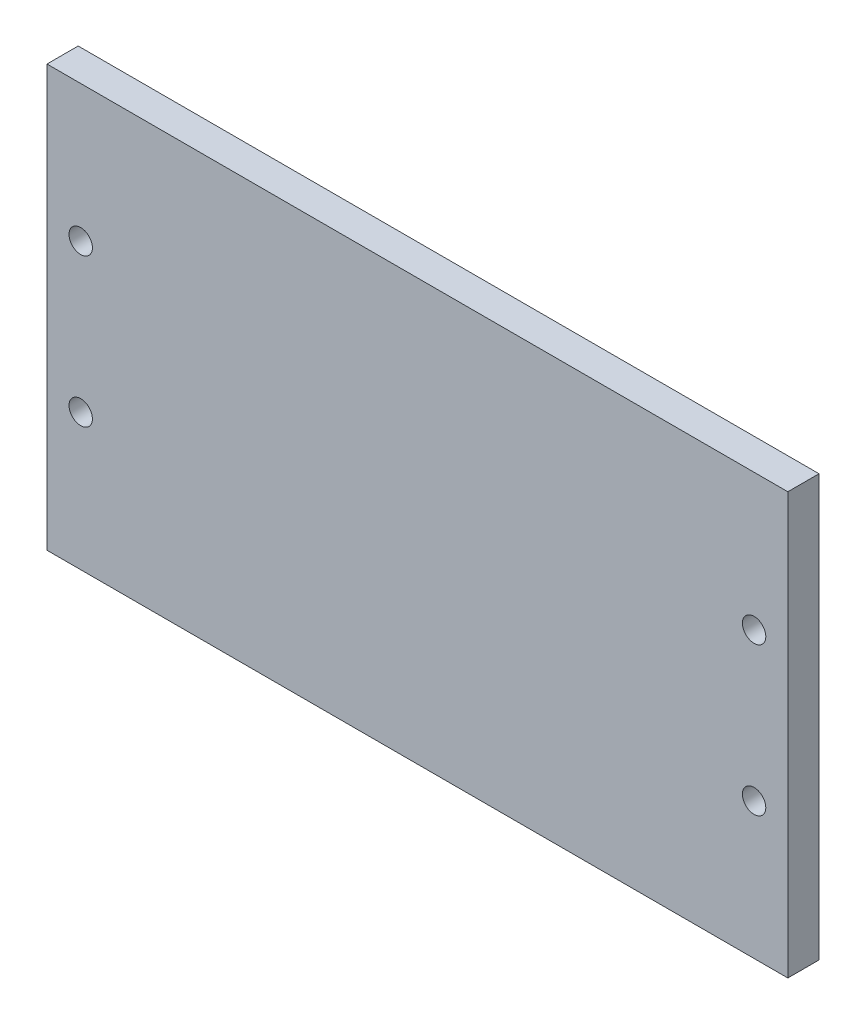
ISO-10303-21;
HEADER;
FILE_DESCRIPTION(('STEP AP214'),'2;1');
FILE_NAME('part.step','',(''),(''),'','','');
FILE_SCHEMA(('AUTOMOTIVE_DESIGN { 1 0 10303 214 1 1 1 1 }'));
ENDSEC;
DATA;
#1=APPLICATION_CONTEXT('core data for automotive mechanical design processes');
#2=APPLICATION_PROTOCOL_DEFINITION('international standard','automotive_design',2000,#1);
#3=PRODUCT_CONTEXT('',#1,'mechanical');
#4=PRODUCT('Part','Part','',(#3));
#5=PRODUCT_RELATED_PRODUCT_CATEGORY('part','',(#4));
#6=PRODUCT_DEFINITION_FORMATION('','',#4);
#7=PRODUCT_DEFINITION_CONTEXT('part definition',#1,'design');
#8=PRODUCT_DEFINITION('design','',#6,#7);
#9=PRODUCT_DEFINITION_SHAPE('','',#8);
#10=(LENGTH_UNIT() NAMED_UNIT(*) SI_UNIT(.MILLI.,.METRE.));
#11=(NAMED_UNIT(*) PLANE_ANGLE_UNIT() SI_UNIT($,.RADIAN.));
#12=(NAMED_UNIT(*) SI_UNIT($,.STERADIAN.) SOLID_ANGLE_UNIT());
#13=UNCERTAINTY_MEASURE_WITH_UNIT(LENGTH_MEASURE(1.E-05),#10,'distance_accuracy_value','');
#14=(GEOMETRIC_REPRESENTATION_CONTEXT(3) GLOBAL_UNCERTAINTY_ASSIGNED_CONTEXT((#13)) GLOBAL_UNIT_ASSIGNED_CONTEXT((#10,
#11,#12)) REPRESENTATION_CONTEXT('',''));
#15=CARTESIAN_POINT('',(0.,0.,0.));
#16=DIRECTION('',(0.,0.,1.));
#17=DIRECTION('',(1.,0.,0.));
#18=AXIS2_PLACEMENT_3D('',#15,#16,#17);
#19=CARTESIAN_POINT('',(0.,0.,8.));
#20=DIRECTION('',(0.,0.,1.));
#21=DIRECTION('',(1.,0.,0.));
#22=AXIS2_PLACEMENT_3D('',#19,#20,#21);
#23=PLANE('',#22);
#24=CARTESIAN_POINT('',(-86.35,19.,8.));
#25=DIRECTION('',(0.,0.,1.));
#26=DIRECTION('',(1.,0.,0.));
#27=AXIS2_PLACEMENT_3D('',#24,#25,#26);
#28=CIRCLE('',#27,3.00000000000001);
#29=CARTESIAN_POINT('',(-83.35,19.,8.));
#30=VERTEX_POINT('',#29);
#31=EDGE_CURVE('E148',#30,#30,#28,.T.);
#32=ORIENTED_EDGE('',*,*,#31,.F.);
#33=EDGE_LOOP('',(#32));
#34=FACE_BOUND('',#33,.T.);
#35=CARTESIAN_POINT('',(86.35,-18.9999999999999,8.));
#36=DIRECTION('',(0.,0.,1.));
#37=DIRECTION('',(1.,0.,0.));
#38=AXIS2_PLACEMENT_3D('',#35,#36,#37);
#39=CIRCLE('',#38,3.00000000000001);
#40=CARTESIAN_POINT('',(89.35,-18.9999999999999,8.));
#41=VERTEX_POINT('',#40);
#42=EDGE_CURVE('E140',#41,#41,#39,.F.);
#43=ORIENTED_EDGE('',*,*,#42,.T.);
#44=EDGE_LOOP('',(#43));
#45=FACE_BOUND('',#44,.T.);
#46=CARTESIAN_POINT('',(-86.35,-19.,8.));
#47=DIRECTION('',(0.,0.,1.));
#48=DIRECTION('',(1.,0.,0.));
#49=AXIS2_PLACEMENT_3D('',#46,#47,#48);
#50=CIRCLE('',#49,3.00000000000001);
#51=CARTESIAN_POINT('',(-83.35,-19.,8.));
#52=VERTEX_POINT('',#51);
#53=EDGE_CURVE('E136',#52,#52,#50,.T.);
#54=ORIENTED_EDGE('',*,*,#53,.F.);
#55=EDGE_LOOP('',(#54));
#56=FACE_BOUND('',#55,.T.);
#57=DIRECTION('',(0.,1.,0.));
#58=VECTOR('',#57,1.);
#59=CARTESIAN_POINT('',(95.,54.,8.));
#60=LINE('',#59,#58);
#61=CARTESIAN_POINT('',(95.,-54.,8.));
#62=VERTEX_POINT('',#61);
#63=CARTESIAN_POINT('',(95.,54.,8.));
#64=VERTEX_POINT('',#63);
#65=EDGE_CURVE('E98',#62,#64,#60,.T.);
#66=ORIENTED_EDGE('',*,*,#65,.T.);
#67=DIRECTION('',(-1.,0.,0.));
#68=VECTOR('',#67,1.);
#69=CARTESIAN_POINT('',(-95.,54.,8.));
#70=LINE('',#69,#68);
#71=CARTESIAN_POINT('',(-95.,54.,8.));
#72=VERTEX_POINT('',#71);
#73=EDGE_CURVE('E93',#64,#72,#70,.T.);
#74=ORIENTED_EDGE('',*,*,#73,.T.);
#75=DIRECTION('',(0.,-1.,0.));
#76=VECTOR('',#75,1.);
#77=CARTESIAN_POINT('',(-95.,54.,8.));
#78=LINE('',#77,#76);
#79=CARTESIAN_POINT('',(-95.,-54.,8.));
#80=VERTEX_POINT('',#79);
#81=EDGE_CURVE('E96',#72,#80,#78,.T.);
#82=ORIENTED_EDGE('',*,*,#81,.T.);
#83=DIRECTION('',(1.,0.,0.));
#84=VECTOR('',#83,1.);
#85=CARTESIAN_POINT('',(-95.,-54.,8.));
#86=LINE('',#85,#84);
#87=EDGE_CURVE('E63',#80,#62,#86,.T.);
#88=ORIENTED_EDGE('',*,*,#87,.T.);
#89=EDGE_LOOP('',(#66,#74,#82,#88));
#90=FACE_BOUND('',#89,.T.);
#91=CARTESIAN_POINT('',(86.35,19.0000000000001,8.));
#92=DIRECTION('',(0.,0.,1.));
#93=DIRECTION('',(1.,0.,0.));
#94=AXIS2_PLACEMENT_3D('',#91,#92,#93);
#95=CIRCLE('',#94,3.);
#96=CARTESIAN_POINT('',(89.35,19.0000000000001,8.));
#97=VERTEX_POINT('',#96);
#98=EDGE_CURVE('E156',#97,#97,#95,.F.);
#99=ORIENTED_EDGE('',*,*,#98,.T.);
#100=EDGE_LOOP('',(#99));
#101=FACE_BOUND('',#100,.T.);
#102=ADVANCED_FACE('F45',(#34,#45,#56,#90,#101),#23,.T.);
#103=CARTESIAN_POINT('',(0.,0.,0.));
#104=DIRECTION('',(0.,0.,1.));
#105=DIRECTION('',(1.,0.,0.));
#106=AXIS2_PLACEMENT_3D('',#103,#104,#105);
#107=PLANE('',#106);
#108=CARTESIAN_POINT('',(-86.35,19.,0.));
#109=DIRECTION('',(0.,0.,1.));
#110=DIRECTION('',(1.,0.,0.));
#111=AXIS2_PLACEMENT_3D('',#108,#109,#110);
#112=CIRCLE('',#111,3.00000000000001);
#113=CARTESIAN_POINT('',(-83.35,19.,0.));
#114=VERTEX_POINT('',#113);
#115=EDGE_CURVE('E144',#114,#114,#112,.T.);
#116=ORIENTED_EDGE('',*,*,#115,.T.);
#117=EDGE_LOOP('',(#116));
#118=FACE_BOUND('',#117,.T.);
#119=CARTESIAN_POINT('',(-86.35,-19.,0.));
#120=DIRECTION('',(0.,0.,1.));
#121=DIRECTION('',(1.,0.,0.));
#122=AXIS2_PLACEMENT_3D('',#119,#120,#121);
#123=CIRCLE('',#122,3.00000000000001);
#124=CARTESIAN_POINT('',(-83.35,-19.,0.));
#125=VERTEX_POINT('',#124);
#126=EDGE_CURVE('E118',#125,#125,#123,.T.);
#127=ORIENTED_EDGE('',*,*,#126,.T.);
#128=EDGE_LOOP('',(#127));
#129=FACE_BOUND('',#128,.T.);
#130=DIRECTION('',(0.,1.,0.));
#131=VECTOR('',#130,1.);
#132=CARTESIAN_POINT('',(95.,54.,0.));
#133=LINE('',#132,#131);
#134=CARTESIAN_POINT('',(95.,-54.,0.));
#135=VERTEX_POINT('',#134);
#136=CARTESIAN_POINT('',(95.,54.,0.));
#137=VERTEX_POINT('',#136);
#138=EDGE_CURVE('E114',#135,#137,#133,.T.);
#139=ORIENTED_EDGE('',*,*,#138,.F.);
#140=DIRECTION('',(1.,0.,0.));
#141=VECTOR('',#140,1.);
#142=CARTESIAN_POINT('',(-95.,-54.,0.));
#143=LINE('',#142,#141);
#144=CARTESIAN_POINT('',(-95.,-54.,0.));
#145=VERTEX_POINT('',#144);
#146=EDGE_CURVE('E86',#145,#135,#143,.T.);
#147=ORIENTED_EDGE('',*,*,#146,.F.);
#148=DIRECTION('',(0.,-1.,0.));
#149=VECTOR('',#148,1.);
#150=CARTESIAN_POINT('',(-95.,54.,0.));
#151=LINE('',#150,#149);
#152=CARTESIAN_POINT('',(-95.,54.,0.));
#153=VERTEX_POINT('',#152);
#154=EDGE_CURVE('E80',#153,#145,#151,.T.);
#155=ORIENTED_EDGE('',*,*,#154,.F.);
#156=DIRECTION('',(-1.,0.,0.));
#157=VECTOR('',#156,1.);
#158=CARTESIAN_POINT('',(-95.,54.,0.));
#159=LINE('',#158,#157);
#160=EDGE_CURVE('E103',#137,#153,#159,.T.);
#161=ORIENTED_EDGE('',*,*,#160,.F.);
#162=EDGE_LOOP('',(#139,#147,#155,#161));
#163=FACE_BOUND('',#162,.T.);
#164=CARTESIAN_POINT('',(86.35,-18.9999999999999,0.));
#165=DIRECTION('',(0.,0.,1.));
#166=DIRECTION('',(1.,0.,0.));
#167=AXIS2_PLACEMENT_3D('',#164,#165,#166);
#168=CIRCLE('',#167,3.00000000000001);
#169=CARTESIAN_POINT('',(89.35,-18.9999999999999,0.));
#170=VERTEX_POINT('',#169);
#171=EDGE_CURVE('E160',#170,#170,#168,.F.);
#172=ORIENTED_EDGE('',*,*,#171,.F.);
#173=EDGE_LOOP('',(#172));
#174=FACE_BOUND('',#173,.T.);
#175=CARTESIAN_POINT('',(86.35,19.0000000000001,0.));
#176=DIRECTION('',(0.,0.,1.));
#177=DIRECTION('',(1.,0.,0.));
#178=AXIS2_PLACEMENT_3D('',#175,#176,#177);
#179=CIRCLE('',#178,3.);
#180=CARTESIAN_POINT('',(89.35,19.0000000000001,0.));
#181=VERTEX_POINT('',#180);
#182=EDGE_CURVE('E152',#181,#181,#179,.F.);
#183=ORIENTED_EDGE('',*,*,#182,.F.);
#184=EDGE_LOOP('',(#183));
#185=FACE_BOUND('',#184,.T.);
#186=ADVANCED_FACE('F131',(#118,#129,#163,#174,#185),#107,.F.);
#187=CARTESIAN_POINT('',(95.,54.,8.));
#188=DIRECTION('',(-1.,0.,0.));
#189=DIRECTION('',(0.,0.,1.));
#190=AXIS2_PLACEMENT_3D('',#187,#188,#189);
#191=PLANE('',#190);
#192=ORIENTED_EDGE('',*,*,#138,.T.);
#193=DIRECTION('',(0.,0.,-1.));
#194=VECTOR('',#193,1.);
#195=CARTESIAN_POINT('',(95.,54.,8.));
#196=LINE('',#195,#194);
#197=EDGE_CURVE('E11',#64,#137,#196,.T.);
#198=ORIENTED_EDGE('',*,*,#197,.F.);
#199=ORIENTED_EDGE('',*,*,#65,.F.);
#200=DIRECTION('',(0.,0.,-1.));
#201=VECTOR('',#200,1.);
#202=CARTESIAN_POINT('',(95.,-54.,8.));
#203=LINE('',#202,#201);
#204=EDGE_CURVE('E110',#62,#135,#203,.T.);
#205=ORIENTED_EDGE('',*,*,#204,.T.);
#206=EDGE_LOOP('',(#192,#198,#199,#205));
#207=FACE_BOUND('',#206,.T.);
#208=ADVANCED_FACE('F47',(#207),#191,.F.);
#209=CARTESIAN_POINT('',(-95.,54.,8.));
#210=DIRECTION('',(0.,-1.,0.));
#211=DIRECTION('',(0.,0.,-1.));
#212=AXIS2_PLACEMENT_3D('',#209,#210,#211);
#213=PLANE('',#212);
#214=ORIENTED_EDGE('',*,*,#160,.T.);
#215=DIRECTION('',(0.,0.,-1.));
#216=VECTOR('',#215,1.);
#217=CARTESIAN_POINT('',(-95.,54.,8.));
#218=LINE('',#217,#216);
#219=EDGE_CURVE('E55',#72,#153,#218,.T.);
#220=ORIENTED_EDGE('',*,*,#219,.F.);
#221=ORIENTED_EDGE('',*,*,#73,.F.);
#222=ORIENTED_EDGE('',*,*,#197,.T.);
#223=EDGE_LOOP('',(#214,#220,#221,#222));
#224=FACE_BOUND('',#223,.T.);
#225=ADVANCED_FACE('F102',(#224),#213,.F.);
#226=CARTESIAN_POINT('',(-95.,54.,8.));
#227=DIRECTION('',(1.,0.,0.));
#228=DIRECTION('',(0.,1.,0.));
#229=AXIS2_PLACEMENT_3D('',#226,#227,#228);
#230=PLANE('',#229);
#231=ORIENTED_EDGE('',*,*,#154,.T.);
#232=DIRECTION('',(0.,0.,-1.));
#233=VECTOR('',#232,1.);
#234=CARTESIAN_POINT('',(-95.,-54.,8.));
#235=LINE('',#234,#233);
#236=EDGE_CURVE('E105',#80,#145,#235,.T.);
#237=ORIENTED_EDGE('',*,*,#236,.F.);
#238=ORIENTED_EDGE('',*,*,#81,.F.);
#239=ORIENTED_EDGE('',*,*,#219,.T.);
#240=EDGE_LOOP('',(#231,#237,#238,#239));
#241=FACE_BOUND('',#240,.T.);
#242=ADVANCED_FACE('F106',(#241),#230,.F.);
#243=CARTESIAN_POINT('',(-95.,-54.,8.));
#244=DIRECTION('',(0.,1.,0.));
#245=DIRECTION('',(0.,0.,1.));
#246=AXIS2_PLACEMENT_3D('',#243,#244,#245);
#247=PLANE('',#246);
#248=ORIENTED_EDGE('',*,*,#146,.T.);
#249=ORIENTED_EDGE('',*,*,#204,.F.);
#250=ORIENTED_EDGE('',*,*,#87,.F.);
#251=ORIENTED_EDGE('',*,*,#236,.T.);
#252=EDGE_LOOP('',(#248,#249,#250,#251));
#253=FACE_BOUND('',#252,.T.);
#254=ADVANCED_FACE('F128',(#253),#247,.F.);
#255=CARTESIAN_POINT('',(-86.35,-19.,0.));
#256=DIRECTION('',(0.,0.,1.));
#257=DIRECTION('',(1.,0.,0.));
#258=AXIS2_PLACEMENT_3D('',#255,#256,#257);
#259=CYLINDRICAL_SURFACE('',#258,3.00000000000001);
#260=ORIENTED_EDGE('',*,*,#126,.F.);
#261=EDGE_LOOP('',(#260));
#262=FACE_BOUND('',#261,.T.);
#263=ORIENTED_EDGE('',*,*,#53,.T.);
#264=EDGE_LOOP('',(#263));
#265=FACE_BOUND('',#264,.T.);
#266=ADVANCED_FACE('F173',(#262,#265),#259,.F.);
#267=CARTESIAN_POINT('',(86.35,-18.9999999999999,0.));
#268=DIRECTION('',(0.,0.,1.));
#269=DIRECTION('',(1.,0.,0.));
#270=AXIS2_PLACEMENT_3D('',#267,#268,#269);
#271=CYLINDRICAL_SURFACE('',#270,3.00000000000001);
#272=ORIENTED_EDGE('',*,*,#171,.T.);
#273=EDGE_LOOP('',(#272));
#274=FACE_BOUND('',#273,.T.);
#275=ORIENTED_EDGE('',*,*,#42,.F.);
#276=EDGE_LOOP('',(#275));
#277=FACE_BOUND('',#276,.T.);
#278=ADVANCED_FACE('F170',(#274,#277),#271,.F.);
#279=CARTESIAN_POINT('',(86.35,19.0000000000001,0.));
#280=DIRECTION('',(0.,0.,1.));
#281=DIRECTION('',(1.,0.,0.));
#282=AXIS2_PLACEMENT_3D('',#279,#280,#281);
#283=CYLINDRICAL_SURFACE('',#282,3.);
#284=ORIENTED_EDGE('',*,*,#182,.T.);
#285=EDGE_LOOP('',(#284));
#286=FACE_BOUND('',#285,.T.);
#287=ORIENTED_EDGE('',*,*,#98,.F.);
#288=EDGE_LOOP('',(#287));
#289=FACE_BOUND('',#288,.T.);
#290=ADVANCED_FACE('F172',(#286,#289),#283,.F.);
#291=CARTESIAN_POINT('',(-86.35,19.,0.));
#292=DIRECTION('',(0.,0.,1.));
#293=DIRECTION('',(1.,0.,0.));
#294=AXIS2_PLACEMENT_3D('',#291,#292,#293);
#295=CYLINDRICAL_SURFACE('',#294,3.00000000000001);
#296=ORIENTED_EDGE('',*,*,#115,.F.);
#297=EDGE_LOOP('',(#296));
#298=FACE_BOUND('',#297,.T.);
#299=ORIENTED_EDGE('',*,*,#31,.T.);
#300=EDGE_LOOP('',(#299));
#301=FACE_BOUND('',#300,.T.);
#302=ADVANCED_FACE('F180',(#298,#301),#295,.F.);
#303=CLOSED_SHELL('',(#102,#186,#208,#225,#242,#254,#266,#278,#290,#302));
#304=MANIFOLD_SOLID_BREP('B2',#303);
#305=ADVANCED_BREP_SHAPE_REPRESENTATION('',(#18,#304),#14);
#306=SHAPE_DEFINITION_REPRESENTATION(#9,#305);
ENDSEC;
END-ISO-10303-21;
